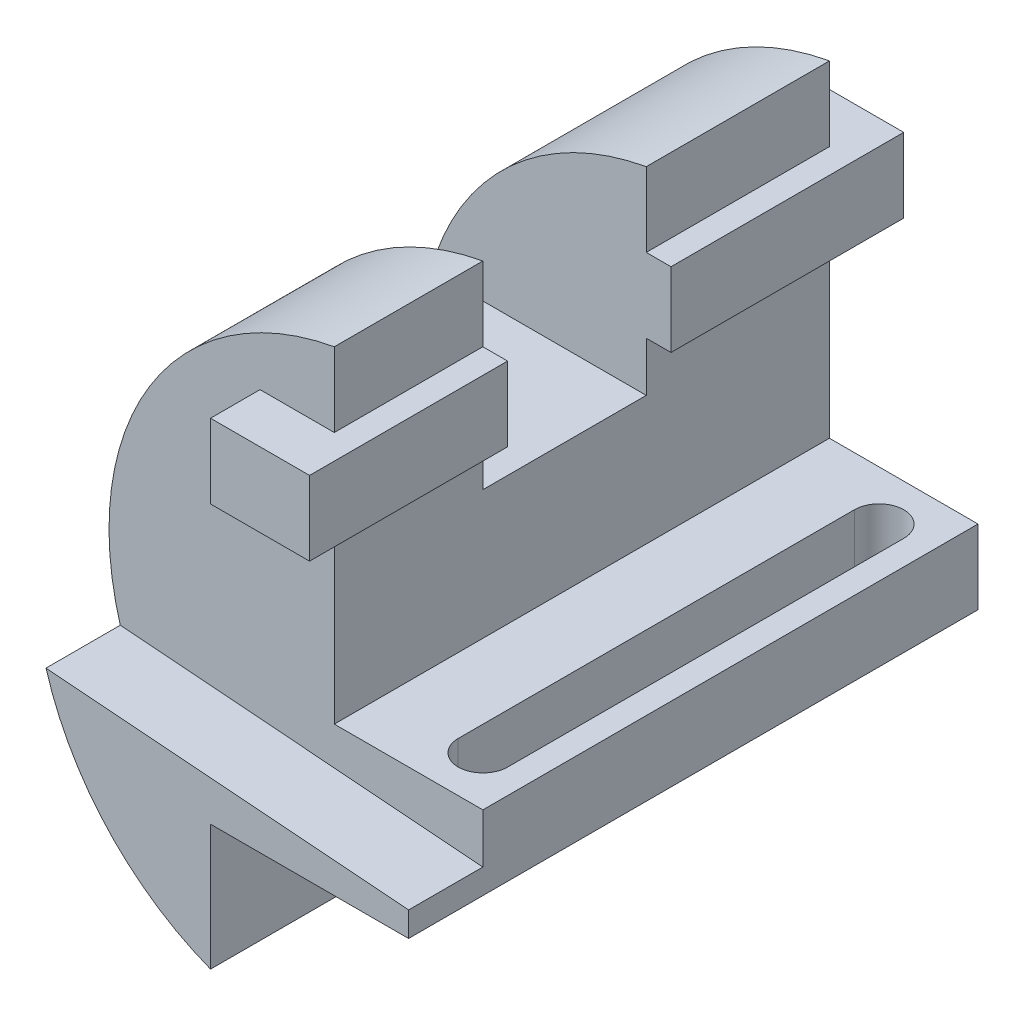
ISO-10303-21;
HEADER;
FILE_DESCRIPTION(('STEP AP214'),'2;1');
FILE_NAME('part.step','',(''),(''),'','','');
FILE_SCHEMA(('AUTOMOTIVE_DESIGN { 1 0 10303 214 1 1 1 1 }'));
ENDSEC;
DATA;
#1=APPLICATION_CONTEXT('core data for automotive mechanical design processes');
#2=APPLICATION_PROTOCOL_DEFINITION('international standard','automotive_design',2000,#1);
#3=PRODUCT_CONTEXT('',#1,'mechanical');
#4=PRODUCT('Part','Part','',(#3));
#5=PRODUCT_RELATED_PRODUCT_CATEGORY('part','',(#4));
#6=PRODUCT_DEFINITION_FORMATION('','',#4);
#7=PRODUCT_DEFINITION_CONTEXT('part definition',#1,'design');
#8=PRODUCT_DEFINITION('design','',#6,#7);
#9=PRODUCT_DEFINITION_SHAPE('','',#8);
#10=(LENGTH_UNIT() NAMED_UNIT(*) SI_UNIT(.MILLI.,.METRE.));
#11=(NAMED_UNIT(*) PLANE_ANGLE_UNIT() SI_UNIT($,.RADIAN.));
#12=(NAMED_UNIT(*) SI_UNIT($,.STERADIAN.) SOLID_ANGLE_UNIT());
#13=UNCERTAINTY_MEASURE_WITH_UNIT(LENGTH_MEASURE(1.E-05),#10,'distance_accuracy_value','');
#14=(GEOMETRIC_REPRESENTATION_CONTEXT(3) GLOBAL_UNCERTAINTY_ASSIGNED_CONTEXT((#13)) GLOBAL_UNIT_ASSIGNED_CONTEXT((#10,
#11,#12)) REPRESENTATION_CONTEXT('',''));
#15=CARTESIAN_POINT('',(0.,0.,0.));
#16=DIRECTION('',(0.,0.,1.));
#17=DIRECTION('',(1.,0.,0.));
#18=AXIS2_PLACEMENT_3D('',#15,#16,#17);
#19=CARTESIAN_POINT('',(-30.,15.,115.));
#20=DIRECTION('',(-1.,0.,0.));
#21=DIRECTION('',(0.,0.,1.));
#22=AXIS2_PLACEMENT_3D('',#19,#20,#21);
#23=PLANE('',#22);
#24=DIRECTION('',(0.,0.,1.));
#25=VECTOR('',#24,1.);
#26=CARTESIAN_POINT('',(-30.,66.,115.));
#27=LINE('',#26,#25);
#28=CARTESIAN_POINT('',(-30.,66.,70.));
#29=VERTEX_POINT('',#28);
#30=CARTESIAN_POINT('',(-30.,66.,100.));
#31=VERTEX_POINT('',#30);
#32=EDGE_CURVE('E324',#29,#31,#27,.T.);
#33=ORIENTED_EDGE('',*,*,#32,.F.);
#34=DIRECTION('',(0.,1.,0.));
#35=VECTOR('',#34,1.);
#36=CARTESIAN_POINT('',(-30.,15.,70.));
#37=LINE('',#36,#35);
#38=CARTESIAN_POINT('',(-30.0000000000001,81.,70.));
#39=VERTEX_POINT('',#38);
#40=EDGE_CURVE('E272',#29,#39,#37,.T.);
#41=ORIENTED_EDGE('',*,*,#40,.T.);
#42=DIRECTION('',(0.,0.,-1.));
#43=VECTOR('',#42,1.);
#44=CARTESIAN_POINT('',(-30.,81.,115.));
#45=LINE('',#44,#43);
#46=CARTESIAN_POINT('',(-30.,81.,100.));
#47=VERTEX_POINT('',#46);
#48=EDGE_CURVE('E396',#47,#39,#45,.T.);
#49=ORIENTED_EDGE('',*,*,#48,.F.);
#50=DIRECTION('',(0.,1.,0.));
#51=VECTOR('',#50,1.);
#52=CARTESIAN_POINT('',(-30.,15.,100.));
#53=LINE('',#52,#51);
#54=EDGE_CURVE('E346',#31,#47,#53,.T.);
#55=ORIENTED_EDGE('',*,*,#54,.F.);
#56=EDGE_LOOP('',(#33,#41,#49,#55));
#57=FACE_BOUND('',#56,.T.);
#58=ADVANCED_FACE('F45',(#57),#23,.F.);
#59=CARTESIAN_POINT('',(-25.,66.,-10.));
#60=DIRECTION('',(-1.,0.,0.));
#61=DIRECTION('',(0.,-1.,0.));
#62=AXIS2_PLACEMENT_3D('',#59,#60,#61);
#63=PLANE('',#62);
#64=DIRECTION('',(0.,0.,1.));
#65=VECTOR('',#64,1.);
#66=CARTESIAN_POINT('',(-25.,51.,-10.));
#67=LINE('',#66,#65);
#68=CARTESIAN_POINT('',(-25.,51.,70.));
#69=VERTEX_POINT('',#68);
#70=CARTESIAN_POINT('',(-25.,51.,110.));
#71=VERTEX_POINT('',#70);
#72=EDGE_CURVE('E320',#69,#71,#67,.T.);
#73=ORIENTED_EDGE('',*,*,#72,.F.);
#74=DIRECTION('',(0.,1.,0.));
#75=VECTOR('',#74,1.);
#76=CARTESIAN_POINT('',(-25.,66.,70.));
#77=LINE('',#76,#75);
#78=CARTESIAN_POINT('',(-25.,66.,70.));
#79=VERTEX_POINT('',#78);
#80=EDGE_CURVE('E269',#69,#79,#77,.T.);
#81=ORIENTED_EDGE('',*,*,#80,.T.);
#82=DIRECTION('',(0.,0.,1.));
#83=VECTOR('',#82,1.);
#84=CARTESIAN_POINT('',(-25.,66.,-10.));
#85=LINE('',#84,#83);
#86=CARTESIAN_POINT('',(-25.,66.,110.));
#87=VERTEX_POINT('',#86);
#88=EDGE_CURVE('E308',#79,#87,#85,.T.);
#89=ORIENTED_EDGE('',*,*,#88,.T.);
#90=DIRECTION('',(0.,1.,0.));
#91=VECTOR('',#90,1.);
#92=CARTESIAN_POINT('',(-25.,66.,110.));
#93=LINE('',#92,#91);
#94=EDGE_CURVE('E293',#71,#87,#93,.T.);
#95=ORIENTED_EDGE('',*,*,#94,.F.);
#96=EDGE_LOOP('',(#73,#81,#89,#95));
#97=FACE_BOUND('',#96,.T.);
#98=ADVANCED_FACE('F449',(#97),#63,.F.);
#99=CARTESIAN_POINT('',(-25.,51.,-10.));
#100=DIRECTION('',(0.,1.,0.));
#101=DIRECTION('',(0.,0.,1.));
#102=AXIS2_PLACEMENT_3D('',#99,#100,#101);
#103=PLANE('',#102);
#104=DIRECTION('',(0.,0.,-1.));
#105=VECTOR('',#104,1.);
#106=CARTESIAN_POINT('',(-30.,51.,115.));
#107=LINE('',#106,#105);
#108=CARTESIAN_POINT('',(-30.,51.,100.));
#109=VERTEX_POINT('',#108);
#110=CARTESIAN_POINT('',(-30.,51.,70.));
#111=VERTEX_POINT('',#110);
#112=EDGE_CURVE('E335',#109,#111,#107,.T.);
#113=ORIENTED_EDGE('',*,*,#112,.T.);
#114=DIRECTION('',(1.,0.,0.));
#115=VECTOR('',#114,1.);
#116=CARTESIAN_POINT('',(-25.,51.,70.));
#117=LINE('',#116,#115);
#118=EDGE_CURVE('E275',#111,#69,#117,.T.);
#119=ORIENTED_EDGE('',*,*,#118,.T.);
#120=ORIENTED_EDGE('',*,*,#72,.T.);
#121=DIRECTION('',(1.,0.,0.));
#122=VECTOR('',#121,1.);
#123=CARTESIAN_POINT('',(-25.,51.,110.));
#124=LINE('',#123,#122);
#125=CARTESIAN_POINT('',(-45.,51.,110.));
#126=VERTEX_POINT('',#125);
#127=EDGE_CURVE('E296',#126,#71,#124,.T.);
#128=ORIENTED_EDGE('',*,*,#127,.F.);
#129=DIRECTION('',(0.,0.,1.));
#130=VECTOR('',#129,1.);
#131=CARTESIAN_POINT('',(-45.,51.,-10.));
#132=LINE('',#131,#130);
#133=CARTESIAN_POINT('',(-45.,51.,100.));
#134=VERTEX_POINT('',#133);
#135=EDGE_CURVE('E316',#134,#126,#132,.T.);
#136=ORIENTED_EDGE('',*,*,#135,.F.);
#137=DIRECTION('',(-1.,0.,0.));
#138=VECTOR('',#137,1.);
#139=CARTESIAN_POINT('',(-20.,51.,100.));
#140=LINE('',#139,#138);
#141=EDGE_CURVE('E409',#109,#134,#140,.T.);
#142=ORIENTED_EDGE('',*,*,#141,.F.);
#143=EDGE_LOOP('',(#113,#119,#120,#128,#136,#142));
#144=FACE_BOUND('',#143,.T.);
#145=ADVANCED_FACE('F458',(#144),#103,.F.);
#146=CARTESIAN_POINT('',(-25.,66.,-10.));
#147=DIRECTION('',(0.,-1.,0.));
#148=DIRECTION('',(0.,0.,-1.));
#149=AXIS2_PLACEMENT_3D('',#146,#147,#148);
#150=PLANE('',#149);
#151=ORIENTED_EDGE('',*,*,#88,.F.);
#152=DIRECTION('',(-1.,0.,0.));
#153=VECTOR('',#152,1.);
#154=CARTESIAN_POINT('',(-25.,66.,70.));
#155=LINE('',#154,#153);
#156=EDGE_CURVE('E415',#79,#29,#155,.T.);
#157=ORIENTED_EDGE('',*,*,#156,.T.);
#158=ORIENTED_EDGE('',*,*,#32,.T.);
#159=DIRECTION('',(1.,0.,0.));
#160=VECTOR('',#159,1.);
#161=CARTESIAN_POINT('',(-20.,66.,100.));
#162=LINE('',#161,#160);
#163=CARTESIAN_POINT('',(-45.,66.,100.));
#164=VERTEX_POINT('',#163);
#165=EDGE_CURVE('E403',#164,#31,#162,.T.);
#166=ORIENTED_EDGE('',*,*,#165,.F.);
#167=DIRECTION('',(0.,0.,1.));
#168=VECTOR('',#167,1.);
#169=CARTESIAN_POINT('',(-45.,66.,-10.));
#170=LINE('',#169,#168);
#171=CARTESIAN_POINT('',(-45.,66.,110.));
#172=VERTEX_POINT('',#171);
#173=EDGE_CURVE('E312',#164,#172,#170,.T.);
#174=ORIENTED_EDGE('',*,*,#173,.T.);
#175=DIRECTION('',(-1.,0.,0.));
#176=VECTOR('',#175,1.);
#177=CARTESIAN_POINT('',(-25.,66.,110.));
#178=LINE('',#177,#176);
#179=EDGE_CURVE('E290',#87,#172,#178,.T.);
#180=ORIENTED_EDGE('',*,*,#179,.F.);
#181=EDGE_LOOP('',(#151,#157,#158,#166,#174,#180));
#182=FACE_BOUND('',#181,.T.);
#183=ADVANCED_FACE('F468',(#182),#150,.F.);
#184=DIRECTION('',(0.,0.,1.));
#185=VECTOR('',#184,1.);
#186=CARTESIAN_POINT('',(-30.,41.,115.));
#187=LINE('',#186,#185);
#188=CARTESIAN_POINT('',(-30.,41.,37.));
#189=VERTEX_POINT('',#188);
#190=CARTESIAN_POINT('',(-30.,41.,70.));
#191=VERTEX_POINT('',#190);
#192=EDGE_CURVE('E284',#189,#191,#187,.T.);
#193=ORIENTED_EDGE('',*,*,#192,.T.);
#194=DIRECTION('',(0.,1.,0.));
#195=VECTOR('',#194,1.);
#196=CARTESIAN_POINT('',(-30.,15.,70.));
#197=LINE('',#196,#195);
#198=EDGE_CURVE('E281',#191,#111,#197,.T.);
#199=ORIENTED_EDGE('',*,*,#198,.T.);
#200=ORIENTED_EDGE('',*,*,#112,.F.);
#201=CARTESIAN_POINT('',(-30.,15.,100.));
#202=VERTEX_POINT('',#201);
#203=EDGE_CURVE('E347',#202,#109,#53,.T.);
#204=ORIENTED_EDGE('',*,*,#203,.F.);
#205=DIRECTION('',(0.,0.,-1.));
#206=VECTOR('',#205,1.);
#207=CARTESIAN_POINT('',(-30.,15.,115.));
#208=LINE('',#207,#206);
#209=CARTESIAN_POINT('',(-30.,15.,0.));
#210=VERTEX_POINT('',#209);
#211=EDGE_CURVE('E399',#202,#210,#208,.T.);
#212=ORIENTED_EDGE('',*,*,#211,.T.);
#213=DIRECTION('',(0.,1.,0.));
#214=VECTOR('',#213,1.);
#215=CARTESIAN_POINT('',(-30.,15.,0.));
#216=LINE('',#215,#214);
#217=CARTESIAN_POINT('',(-30.,51.,0.));
#218=VERTEX_POINT('',#217);
#219=EDGE_CURVE('E379',#210,#218,#216,.T.);
#220=ORIENTED_EDGE('',*,*,#219,.T.);
#221=CARTESIAN_POINT('',(-30.,51.,37.));
#222=VERTEX_POINT('',#221);
#223=EDGE_CURVE('E334',#222,#218,#107,.T.);
#224=ORIENTED_EDGE('',*,*,#223,.F.);
#225=DIRECTION('',(0.,-1.,0.));
#226=VECTOR('',#225,1.);
#227=CARTESIAN_POINT('',(-30.,15.,37.));
#228=LINE('',#227,#226);
#229=EDGE_CURVE('E266',#222,#189,#228,.T.);
#230=ORIENTED_EDGE('',*,*,#229,.T.);
#231=EDGE_LOOP('',(#193,#199,#200,#204,#212,#220,#224,#230));
#232=FACE_BOUND('',#231,.T.);
#233=ADVANCED_FACE('F453',(#232),#23,.F.);
#234=CARTESIAN_POINT('',(-30.0000000000001,81.,37.));
#235=VERTEX_POINT('',#234);
#236=CARTESIAN_POINT('',(-30.,81.,0.));
#237=VERTEX_POINT('',#236);
#238=EDGE_CURVE('E395',#235,#237,#45,.T.);
#239=ORIENTED_EDGE('',*,*,#238,.F.);
#240=DIRECTION('',(0.,-1.,0.));
#241=VECTOR('',#240,1.);
#242=CARTESIAN_POINT('',(-30.,15.,37.));
#243=LINE('',#242,#241);
#244=CARTESIAN_POINT('',(-30.,66.,37.));
#245=VERTEX_POINT('',#244);
#246=EDGE_CURVE('E257',#235,#245,#243,.T.);
#247=ORIENTED_EDGE('',*,*,#246,.T.);
#248=CARTESIAN_POINT('',(-30.,66.,0.));
#249=VERTEX_POINT('',#248);
#250=EDGE_CURVE('E325',#249,#245,#27,.T.);
#251=ORIENTED_EDGE('',*,*,#250,.F.);
#252=EDGE_CURVE('E378',#249,#237,#216,.T.);
#253=ORIENTED_EDGE('',*,*,#252,.T.);
#254=EDGE_LOOP('',(#239,#247,#251,#253));
#255=FACE_BOUND('',#254,.T.);
#256=ADVANCED_FACE('F452',(#255),#23,.F.);
#257=CARTESIAN_POINT('',(-20.,26.4083339693685,0.));
#258=DIRECTION('',(0.,0.,-1.));
#259=DIRECTION('',(-1.,0.,0.));
#260=AXIS2_PLACEMENT_3D('',#257,#258,#259);
#261=PLANE('',#260);
#262=DIRECTION('',(0.,-1.,0.));
#263=VECTOR('',#262,1.);
#264=CARTESIAN_POINT('',(-45.,26.4083339693685,0.));
#265=LINE('',#264,#263);
#266=CARTESIAN_POINT('',(-45.,66.,0.));
#267=VERTEX_POINT('',#266);
#268=CARTESIAN_POINT('',(-45.,51.,0.));
#269=VERTEX_POINT('',#268);
#270=EDGE_CURVE('E331',#267,#269,#265,.T.);
#271=ORIENTED_EDGE('',*,*,#270,.T.);
#272=DIRECTION('',(1.,0.,0.));
#273=VECTOR('',#272,1.);
#274=CARTESIAN_POINT('',(-20.,51.,0.));
#275=LINE('',#274,#273);
#276=EDGE_CURVE('E338',#269,#218,#275,.T.);
#277=ORIENTED_EDGE('',*,*,#276,.T.);
#278=ORIENTED_EDGE('',*,*,#219,.F.);
#279=DIRECTION('',(-1.,0.,0.));
#280=VECTOR('',#279,1.);
#281=CARTESIAN_POINT('',(0.,15.,0.));
#282=LINE('',#281,#280);
#283=CARTESIAN_POINT('',(0.,15.,0.));
#284=VERTEX_POINT('',#283);
#285=EDGE_CURVE('E375',#284,#210,#282,.T.);
#286=ORIENTED_EDGE('',*,*,#285,.F.);
#287=DIRECTION('',(0.,1.,0.));
#288=VECTOR('',#287,1.);
#289=CARTESIAN_POINT('',(0.,0.,0.));
#290=LINE('',#289,#288);
#291=CARTESIAN_POINT('',(0.,0.,0.));
#292=VERTEX_POINT('',#291);
#293=EDGE_CURVE('E360',#292,#284,#290,.T.);
#294=ORIENTED_EDGE('',*,*,#293,.F.);
#295=DIRECTION('',(1.,0.,0.));
#296=VECTOR('',#295,1.);
#297=CARTESIAN_POINT('',(0.,0.,0.));
#298=LINE('',#297,#296);
#299=CARTESIAN_POINT('',(-40.,0.,0.));
#300=VERTEX_POINT('',#299);
#301=EDGE_CURVE('E366',#300,#292,#298,.T.);
#302=ORIENTED_EDGE('',*,*,#301,.F.);
#303=DIRECTION('',(0.,1.,0.));
#304=VECTOR('',#303,1.);
#305=CARTESIAN_POINT('',(-40.,0.,0.));
#306=LINE('',#305,#304);
#307=CARTESIAN_POINT('',(-40.,-25.3627969821569,0.));
#308=VERTEX_POINT('',#307);
#309=EDGE_CURVE('E384',#308,#300,#306,.T.);
#310=ORIENTED_EDGE('',*,*,#309,.F.);
#311=CARTESIAN_POINT('',(-20.,26.4083339693685,0.));
#312=DIRECTION('',(0.,0.,1.));
#313=DIRECTION('',(-1.,0.,0.));
#314=AXIS2_PLACEMENT_3D('',#311,#312,#313);
#315=CIRCLE('',#314,55.5);
#316=EDGE_CURVE('E382',#237,#308,#315,.T.);
#317=ORIENTED_EDGE('',*,*,#316,.F.);
#318=ORIENTED_EDGE('',*,*,#252,.F.);
#319=DIRECTION('',(-1.,0.,0.));
#320=VECTOR('',#319,1.);
#321=CARTESIAN_POINT('',(-20.,66.,0.));
#322=LINE('',#321,#320);
#323=EDGE_CURVE('E328',#249,#267,#322,.T.);
#324=ORIENTED_EDGE('',*,*,#323,.T.);
#325=EDGE_LOOP('',(#271,#277,#278,#286,#294,#302,#310,#317,#318,#324));
#326=FACE_BOUND('',#325,.T.);
#327=ADVANCED_FACE('F465',(#326),#261,.T.);
#328=CARTESIAN_POINT('',(-20.,26.4083339693685,100.));
#329=DIRECTION('',(0.,0.,1.));
#330=DIRECTION('',(1.,0.,0.));
#331=AXIS2_PLACEMENT_3D('',#328,#329,#330);
#332=PLANE('',#331);
#333=ORIENTED_EDGE('',*,*,#203,.T.);
#334=ORIENTED_EDGE('',*,*,#141,.T.);
#335=DIRECTION('',(0.,1.,0.));
#336=VECTOR('',#335,1.);
#337=CARTESIAN_POINT('',(-45.,26.4083339693685,100.));
#338=LINE('',#337,#336);
#339=EDGE_CURVE('E406',#134,#164,#338,.T.);
#340=ORIENTED_EDGE('',*,*,#339,.T.);
#341=ORIENTED_EDGE('',*,*,#165,.T.);
#342=ORIENTED_EDGE('',*,*,#54,.T.);
#343=CARTESIAN_POINT('',(-20.,26.4083339693685,100.));
#344=DIRECTION('',(0.,0.,1.));
#345=DIRECTION('',(1.,0.,0.));
#346=AXIS2_PLACEMENT_3D('',#343,#344,#345);
#347=CIRCLE('',#346,55.5);
#348=CARTESIAN_POINT('',(-73.2263825921053,10.6856689230469,100.));
#349=VERTEX_POINT('',#348);
#350=EDGE_CURVE('E350',#47,#349,#347,.T.);
#351=ORIENTED_EDGE('',*,*,#350,.T.);
#352=DIRECTION('',(0.996999181764582,-0.0774120892416338,0.));
#353=VECTOR('',#352,1.);
#354=CARTESIAN_POINT('',(0.,5.,100.));
#355=LINE('',#354,#353);
#356=CARTESIAN_POINT('',(0.,5.,100.));
#357=VERTEX_POINT('',#356);
#358=EDGE_CURVE('E352',#349,#357,#355,.T.);
#359=ORIENTED_EDGE('',*,*,#358,.T.);
#360=DIRECTION('',(0.,1.,0.));
#361=VECTOR('',#360,1.);
#362=CARTESIAN_POINT('',(0.,5.,100.));
#363=LINE('',#362,#361);
#364=CARTESIAN_POINT('',(0.,15.,100.));
#365=VERTEX_POINT('',#364);
#366=EDGE_CURVE('E342',#357,#365,#363,.T.);
#367=ORIENTED_EDGE('',*,*,#366,.T.);
#368=DIRECTION('',(-1.,0.,0.));
#369=VECTOR('',#368,1.);
#370=CARTESIAN_POINT('',(0.,15.,100.));
#371=LINE('',#370,#369);
#372=EDGE_CURVE('E344',#365,#202,#371,.T.);
#373=ORIENTED_EDGE('',*,*,#372,.T.);
#374=EDGE_LOOP('',(#333,#334,#340,#341,#342,#351,#359,#367,#373));
#375=FACE_BOUND('',#374,.T.);
#376=ADVANCED_FACE('F511',(#375),#332,.T.);
#377=CARTESIAN_POINT('',(0.,15.,115.));
#378=DIRECTION('',(0.,-1.,0.));
#379=DIRECTION('',(1.,0.,0.));
#380=AXIS2_PLACEMENT_3D('',#377,#378,#379);
#381=PLANE('',#380);
#382=DIRECTION('',(0.,0.,-1.));
#383=VECTOR('',#382,1.);
#384=CARTESIAN_POINT('',(-14.9803454801797,15.,115.));
#385=LINE('',#384,#383);
#386=CARTESIAN_POINT('',(-14.9803454801797,15.,90.));
#387=VERTEX_POINT('',#386);
#388=CARTESIAN_POINT('',(-14.9803454801797,15.,10.));
#389=VERTEX_POINT('',#388);
#390=EDGE_CURVE('E221',#387,#389,#385,.T.);
#391=ORIENTED_EDGE('',*,*,#390,.T.);
#392=CARTESIAN_POINT('',(-9.98034548017967,15.,10.));
#393=DIRECTION('',(0.,-1.,0.));
#394=DIRECTION('',(1.,0.,0.));
#395=AXIS2_PLACEMENT_3D('',#392,#393,#394);
#396=CIRCLE('',#395,5.);
#397=CARTESIAN_POINT('',(-4.98034548017966,15.,10.));
#398=VERTEX_POINT('',#397);
#399=EDGE_CURVE('E243',#389,#398,#396,.T.);
#400=ORIENTED_EDGE('',*,*,#399,.T.);
#401=DIRECTION('',(0.,0.,1.));
#402=VECTOR('',#401,1.);
#403=CARTESIAN_POINT('',(-4.98034548017967,15.,115.));
#404=LINE('',#403,#402);
#405=CARTESIAN_POINT('',(-4.98034548017967,15.,90.));
#406=VERTEX_POINT('',#405);
#407=EDGE_CURVE('E241',#398,#406,#404,.T.);
#408=ORIENTED_EDGE('',*,*,#407,.T.);
#409=CARTESIAN_POINT('',(-9.98034548017967,15.,90.));
#410=DIRECTION('',(0.,-1.,0.));
#411=DIRECTION('',(1.,0.,0.));
#412=AXIS2_PLACEMENT_3D('',#409,#410,#411);
#413=CIRCLE('',#412,5.);
#414=EDGE_CURVE('E226',#406,#387,#413,.T.);
#415=ORIENTED_EDGE('',*,*,#414,.T.);
#416=EDGE_LOOP('',(#391,#400,#408,#415));
#417=FACE_BOUND('',#416,.T.);
#418=ORIENTED_EDGE('',*,*,#372,.F.);
#419=DIRECTION('',(0.,0.,-1.));
#420=VECTOR('',#419,1.);
#421=CARTESIAN_POINT('',(0.,15.,115.));
#422=LINE('',#421,#420);
#423=EDGE_CURVE('E401',#365,#284,#422,.T.);
#424=ORIENTED_EDGE('',*,*,#423,.T.);
#425=ORIENTED_EDGE('',*,*,#285,.T.);
#426=ORIENTED_EDGE('',*,*,#211,.F.);
#427=EDGE_LOOP('',(#418,#424,#425,#426));
#428=FACE_BOUND('',#427,.T.);
#429=ADVANCED_FACE('F239',(#417,#428),#381,.F.);
#430=CARTESIAN_POINT('',(0.,0.,115.));
#431=DIRECTION('',(-1.,0.,0.));
#432=DIRECTION('',(0.,0.,1.));
#433=AXIS2_PLACEMENT_3D('',#430,#431,#432);
#434=PLANE('',#433);
#435=ORIENTED_EDGE('',*,*,#366,.F.);
#436=DIRECTION('',(0.,0.,1.));
#437=VECTOR('',#436,1.);
#438=CARTESIAN_POINT('',(0.,5.,100.));
#439=LINE('',#438,#437);
#440=CARTESIAN_POINT('',(0.,5.,115.));
#441=VERTEX_POINT('',#440);
#442=EDGE_CURVE('E357',#357,#441,#439,.T.);
#443=ORIENTED_EDGE('',*,*,#442,.T.);
#444=DIRECTION('',(0.,1.,0.));
#445=VECTOR('',#444,1.);
#446=CARTESIAN_POINT('',(0.,0.,115.));
#447=LINE('',#446,#445);
#448=CARTESIAN_POINT('',(0.,0.,115.));
#449=VERTEX_POINT('',#448);
#450=EDGE_CURVE('E362',#449,#441,#447,.T.);
#451=ORIENTED_EDGE('',*,*,#450,.F.);
#452=DIRECTION('',(0.,0.,-1.));
#453=VECTOR('',#452,1.);
#454=CARTESIAN_POINT('',(0.,0.,115.));
#455=LINE('',#454,#453);
#456=EDGE_CURVE('E372',#449,#292,#455,.T.);
#457=ORIENTED_EDGE('',*,*,#456,.T.);
#458=ORIENTED_EDGE('',*,*,#293,.T.);
#459=ORIENTED_EDGE('',*,*,#423,.F.);
#460=EDGE_LOOP('',(#435,#443,#451,#457,#458,#459));
#461=FACE_BOUND('',#460,.T.);
#462=ADVANCED_FACE('F47',(#461),#434,.F.);
#463=CARTESIAN_POINT('',(-20.,26.4083339693685,115.));
#464=DIRECTION('',(0.,0.,-1.));
#465=DIRECTION('',(-1.,0.,0.));
#466=AXIS2_PLACEMENT_3D('',#463,#464,#465);
#467=CYLINDRICAL_SURFACE('',#466,55.5);
#468=ORIENTED_EDGE('',*,*,#48,.T.);
#469=CARTESIAN_POINT('',(-20.,26.4083339693685,70.));
#470=DIRECTION('',(0.,0.,1.));
#471=DIRECTION('',(1.,0.,0.));
#472=AXIS2_PLACEMENT_3D('',#469,#470,#471);
#473=CIRCLE('',#472,55.5);
#474=CARTESIAN_POINT('',(-73.5474862383895,41.,70.));
#475=VERTEX_POINT('',#474);
#476=EDGE_CURVE('E278',#39,#475,#473,.T.);
#477=ORIENTED_EDGE('',*,*,#476,.T.);
#478=DIRECTION('',(0.,0.,-1.));
#479=VECTOR('',#478,1.);
#480=CARTESIAN_POINT('',(-73.5474862383895,41.,115.));
#481=LINE('',#480,#479);
#482=CARTESIAN_POINT('',(-73.5474862383895,41.,37.));
#483=VERTEX_POINT('',#482);
#484=EDGE_CURVE('E418',#475,#483,#481,.T.);
#485=ORIENTED_EDGE('',*,*,#484,.T.);
#486=CARTESIAN_POINT('',(-20.,26.4083339693685,37.));
#487=DIRECTION('',(0.,0.,-1.));
#488=DIRECTION('',(0.,1.,0.));
#489=AXIS2_PLACEMENT_3D('',#486,#487,#488);
#490=CIRCLE('',#489,55.5);
#491=EDGE_CURVE('E263',#483,#235,#490,.T.);
#492=ORIENTED_EDGE('',*,*,#491,.T.);
#493=ORIENTED_EDGE('',*,*,#238,.T.);
#494=ORIENTED_EDGE('',*,*,#316,.T.);
#495=DIRECTION('',(0.,0.,-1.));
#496=VECTOR('',#495,1.);
#497=CARTESIAN_POINT('',(-40.,-25.3627969821569,115.));
#498=LINE('',#497,#496);
#499=CARTESIAN_POINT('',(-40.,-25.3627969821569,115.));
#500=VERTEX_POINT('',#499);
#501=EDGE_CURVE('E392',#500,#308,#498,.T.);
#502=ORIENTED_EDGE('',*,*,#501,.F.);
#503=CARTESIAN_POINT('',(-20.,26.4083339693685,115.));
#504=DIRECTION('',(0.,0.,1.));
#505=DIRECTION('',(-1.,0.,0.));
#506=AXIS2_PLACEMENT_3D('',#503,#504,#505);
#507=CIRCLE('',#506,55.5);
#508=CARTESIAN_POINT('',(-73.2263825921054,10.6856689230469,115.));
#509=VERTEX_POINT('',#508);
#510=EDGE_CURVE('E365',#509,#500,#507,.T.);
#511=ORIENTED_EDGE('',*,*,#510,.F.);
#512=DIRECTION('',(0.,0.,1.));
#513=VECTOR('',#512,1.);
#514=CARTESIAN_POINT('',(-73.2263825921053,10.6856689230469,100.));
#515=LINE('',#514,#513);
#516=EDGE_CURVE('E355',#349,#509,#515,.T.);
#517=ORIENTED_EDGE('',*,*,#516,.F.);
#518=ORIENTED_EDGE('',*,*,#350,.F.);
#519=EDGE_LOOP('',(#468,#477,#485,#492,#493,#494,#502,#511,#517,#518));
#520=FACE_BOUND('',#519,.T.);
#521=ADVANCED_FACE('F484',(#520),#467,.T.);
#522=CARTESIAN_POINT('',(-40.,0.,115.));
#523=DIRECTION('',(-1.,0.,0.));
#524=DIRECTION('',(0.,-1.,0.));
#525=AXIS2_PLACEMENT_3D('',#522,#523,#524);
#526=PLANE('',#525);
#527=ORIENTED_EDGE('',*,*,#309,.T.);
#528=DIRECTION('',(0.,0.,-1.));
#529=VECTOR('',#528,1.);
#530=CARTESIAN_POINT('',(-40.,0.,115.));
#531=LINE('',#530,#529);
#532=CARTESIAN_POINT('',(-40.,0.,115.));
#533=VERTEX_POINT('',#532);
#534=EDGE_CURVE('E389',#533,#300,#531,.T.);
#535=ORIENTED_EDGE('',*,*,#534,.F.);
#536=DIRECTION('',(0.,1.,0.));
#537=VECTOR('',#536,1.);
#538=CARTESIAN_POINT('',(-40.,0.,115.));
#539=LINE('',#538,#537);
#540=EDGE_CURVE('E368',#500,#533,#539,.T.);
#541=ORIENTED_EDGE('',*,*,#540,.F.);
#542=ORIENTED_EDGE('',*,*,#501,.T.);
#543=EDGE_LOOP('',(#527,#535,#541,#542));
#544=FACE_BOUND('',#543,.T.);
#545=ADVANCED_FACE('F496',(#544),#526,.F.);
#546=CARTESIAN_POINT('',(0.,0.,115.));
#547=DIRECTION('',(0.,1.,0.));
#548=DIRECTION('',(-1.,0.,0.));
#549=AXIS2_PLACEMENT_3D('',#546,#547,#548);
#550=PLANE('',#549);
#551=DIRECTION('',(0.,0.,-1.));
#552=VECTOR('',#551,1.);
#553=CARTESIAN_POINT('',(-4.98034548017967,0.,115.));
#554=LINE('',#553,#552);
#555=CARTESIAN_POINT('',(-4.98034548017967,0.,90.));
#556=VERTEX_POINT('',#555);
#557=CARTESIAN_POINT('',(-4.98034548017966,0.,10.));
#558=VERTEX_POINT('',#557);
#559=EDGE_CURVE('E53',#556,#558,#554,.T.);
#560=ORIENTED_EDGE('',*,*,#559,.T.);
#561=CARTESIAN_POINT('',(-9.98034548017966,0.,10.));
#562=DIRECTION('',(0.,1.,0.));
#563=DIRECTION('',(-1.,0.,0.));
#564=AXIS2_PLACEMENT_3D('',#561,#562,#563);
#565=CIRCLE('',#564,5.);
#566=CARTESIAN_POINT('',(-14.9803454801797,0.,10.));
#567=VERTEX_POINT('',#566);
#568=EDGE_CURVE('E12',#558,#567,#565,.T.);
#569=ORIENTED_EDGE('',*,*,#568,.T.);
#570=DIRECTION('',(0.,0.,1.));
#571=VECTOR('',#570,1.);
#572=CARTESIAN_POINT('',(-14.9803454801797,0.,115.));
#573=LINE('',#572,#571);
#574=CARTESIAN_POINT('',(-14.9803454801797,0.,90.));
#575=VERTEX_POINT('',#574);
#576=EDGE_CURVE('E421',#567,#575,#573,.T.);
#577=ORIENTED_EDGE('',*,*,#576,.T.);
#578=CARTESIAN_POINT('',(-9.98034548017967,0.,90.));
#579=DIRECTION('',(0.,1.,0.));
#580=DIRECTION('',(-1.,0.,0.));
#581=AXIS2_PLACEMENT_3D('',#578,#579,#580);
#582=CIRCLE('',#581,5.);
#583=EDGE_CURVE('E234',#575,#556,#582,.T.);
#584=ORIENTED_EDGE('',*,*,#583,.T.);
#585=EDGE_LOOP('',(#560,#569,#577,#584));
#586=FACE_BOUND('',#585,.T.);
#587=ORIENTED_EDGE('',*,*,#301,.T.);
#588=ORIENTED_EDGE('',*,*,#456,.F.);
#589=DIRECTION('',(1.,0.,0.));
#590=VECTOR('',#589,1.);
#591=CARTESIAN_POINT('',(0.,0.,115.));
#592=LINE('',#591,#590);
#593=EDGE_CURVE('E370',#533,#449,#592,.T.);
#594=ORIENTED_EDGE('',*,*,#593,.F.);
#595=ORIENTED_EDGE('',*,*,#534,.T.);
#596=EDGE_LOOP('',(#587,#588,#594,#595));
#597=FACE_BOUND('',#596,.T.);
#598=ADVANCED_FACE('F425',(#586,#597),#550,.F.);
#599=CARTESIAN_POINT('',(-20.,26.4083339693685,115.));
#600=DIRECTION('',(0.,0.,-1.));
#601=DIRECTION('',(-1.,0.,0.));
#602=AXIS2_PLACEMENT_3D('',#599,#600,#601);
#603=PLANE('',#602);
#604=ORIENTED_EDGE('',*,*,#450,.T.);
#605=DIRECTION('',(0.996999181764582,-0.0774120892416338,0.));
#606=VECTOR('',#605,1.);
#607=CARTESIAN_POINT('',(0.,5.,115.));
#608=LINE('',#607,#606);
#609=EDGE_CURVE('E341',#509,#441,#608,.T.);
#610=ORIENTED_EDGE('',*,*,#609,.F.);
#611=ORIENTED_EDGE('',*,*,#510,.T.);
#612=ORIENTED_EDGE('',*,*,#540,.T.);
#613=ORIENTED_EDGE('',*,*,#593,.T.);
#614=EDGE_LOOP('',(#604,#610,#611,#612,#613));
#615=FACE_BOUND('',#614,.T.);
#616=ADVANCED_FACE('F500',(#615),#603,.F.);
#617=CARTESIAN_POINT('',(0.,5.,100.));
#618=DIRECTION('',(-0.0774120892416338,-0.996999181764582,0.));
#619=DIRECTION('',(0.996999181764582,-0.0774120892416338,0.));
#620=AXIS2_PLACEMENT_3D('',#617,#618,#619);
#621=PLANE('',#620);
#622=ORIENTED_EDGE('',*,*,#609,.T.);
#623=ORIENTED_EDGE('',*,*,#442,.F.);
#624=ORIENTED_EDGE('',*,*,#358,.F.);
#625=ORIENTED_EDGE('',*,*,#516,.T.);
#626=EDGE_LOOP('',(#622,#623,#624,#625));
#627=FACE_BOUND('',#626,.T.);
#628=ADVANCED_FACE('F508',(#627),#621,.F.);
#629=CARTESIAN_POINT('',(-45.,66.,-10.));
#630=DIRECTION('',(1.,0.,0.));
#631=DIRECTION('',(0.,0.,-1.));
#632=AXIS2_PLACEMENT_3D('',#629,#630,#631);
#633=PLANE('',#632);
#634=ORIENTED_EDGE('',*,*,#270,.F.);
#635=CARTESIAN_POINT('',(-45.,66.,-10.));
#636=VERTEX_POINT('',#635);
#637=EDGE_CURVE('E313',#636,#267,#170,.T.);
#638=ORIENTED_EDGE('',*,*,#637,.F.);
#639=DIRECTION('',(0.,1.,0.));
#640=VECTOR('',#639,1.);
#641=CARTESIAN_POINT('',(-45.,66.,-10.));
#642=LINE('',#641,#640);
#643=CARTESIAN_POINT('',(-45.,51.,-10.));
#644=VERTEX_POINT('',#643);
#645=EDGE_CURVE('E304',#644,#636,#642,.T.);
#646=ORIENTED_EDGE('',*,*,#645,.F.);
#647=EDGE_CURVE('E317',#644,#269,#132,.T.);
#648=ORIENTED_EDGE('',*,*,#647,.T.);
#649=EDGE_LOOP('',(#634,#638,#646,#648));
#650=FACE_BOUND('',#649,.T.);
#651=ADVANCED_FACE('F553',(#650),#633,.F.);
#652=CARTESIAN_POINT('',(-25.,66.,-10.));
#653=VERTEX_POINT('',#652);
#654=CARTESIAN_POINT('',(-25.,66.,37.));
#655=VERTEX_POINT('',#654);
#656=EDGE_CURVE('E309',#653,#655,#85,.T.);
#657=ORIENTED_EDGE('',*,*,#656,.T.);
#658=DIRECTION('',(0.,-1.,0.));
#659=VECTOR('',#658,1.);
#660=CARTESIAN_POINT('',(-25.,66.,37.));
#661=LINE('',#660,#659);
#662=CARTESIAN_POINT('',(-25.,51.,37.));
#663=VERTEX_POINT('',#662);
#664=EDGE_CURVE('E252',#655,#663,#661,.T.);
#665=ORIENTED_EDGE('',*,*,#664,.T.);
#666=CARTESIAN_POINT('',(-25.,51.,-10.));
#667=VERTEX_POINT('',#666);
#668=EDGE_CURVE('E321',#667,#663,#67,.T.);
#669=ORIENTED_EDGE('',*,*,#668,.F.);
#670=DIRECTION('',(0.,-1.,0.));
#671=VECTOR('',#670,1.);
#672=CARTESIAN_POINT('',(-25.,66.,-10.));
#673=LINE('',#672,#671);
#674=EDGE_CURVE('E299',#653,#667,#673,.T.);
#675=ORIENTED_EDGE('',*,*,#674,.F.);
#676=EDGE_LOOP('',(#657,#665,#669,#675));
#677=FACE_BOUND('',#676,.T.);
#678=ADVANCED_FACE('F461',(#677),#63,.F.);
#679=ORIENTED_EDGE('',*,*,#668,.T.);
#680=DIRECTION('',(-1.,0.,0.));
#681=VECTOR('',#680,1.);
#682=CARTESIAN_POINT('',(-25.,51.,37.));
#683=LINE('',#682,#681);
#684=EDGE_CURVE('E260',#663,#222,#683,.T.);
#685=ORIENTED_EDGE('',*,*,#684,.T.);
#686=ORIENTED_EDGE('',*,*,#223,.T.);
#687=ORIENTED_EDGE('',*,*,#276,.F.);
#688=ORIENTED_EDGE('',*,*,#647,.F.);
#689=DIRECTION('',(-1.,0.,0.));
#690=VECTOR('',#689,1.);
#691=CARTESIAN_POINT('',(-25.,51.,-10.));
#692=LINE('',#691,#690);
#693=EDGE_CURVE('E302',#667,#644,#692,.T.);
#694=ORIENTED_EDGE('',*,*,#693,.F.);
#695=EDGE_LOOP('',(#679,#685,#686,#687,#688,#694));
#696=FACE_BOUND('',#695,.T.);
#697=ADVANCED_FACE('F552',(#696),#103,.F.);
#698=ORIENTED_EDGE('',*,*,#339,.F.);
#699=ORIENTED_EDGE('',*,*,#135,.T.);
#700=DIRECTION('',(0.,-1.,0.));
#701=VECTOR('',#700,1.);
#702=CARTESIAN_POINT('',(-45.,66.,110.));
#703=LINE('',#702,#701);
#704=EDGE_CURVE('E287',#172,#126,#703,.T.);
#705=ORIENTED_EDGE('',*,*,#704,.F.);
#706=ORIENTED_EDGE('',*,*,#173,.F.);
#707=EDGE_LOOP('',(#698,#699,#705,#706));
#708=FACE_BOUND('',#707,.T.);
#709=ADVANCED_FACE('F526',(#708),#633,.F.);
#710=ORIENTED_EDGE('',*,*,#250,.T.);
#711=DIRECTION('',(1.,0.,0.));
#712=VECTOR('',#711,1.);
#713=CARTESIAN_POINT('',(-25.,66.,37.));
#714=LINE('',#713,#712);
#715=EDGE_CURVE('E412',#245,#655,#714,.T.);
#716=ORIENTED_EDGE('',*,*,#715,.T.);
#717=ORIENTED_EDGE('',*,*,#656,.F.);
#718=DIRECTION('',(1.,0.,0.));
#719=VECTOR('',#718,1.);
#720=CARTESIAN_POINT('',(-25.,66.,-10.));
#721=LINE('',#720,#719);
#722=EDGE_CURVE('E306',#636,#653,#721,.T.);
#723=ORIENTED_EDGE('',*,*,#722,.F.);
#724=ORIENTED_EDGE('',*,*,#637,.T.);
#725=ORIENTED_EDGE('',*,*,#323,.F.);
#726=EDGE_LOOP('',(#710,#716,#717,#723,#724,#725));
#727=FACE_BOUND('',#726,.T.);
#728=ADVANCED_FACE('F475',(#727),#150,.F.);
#729=CARTESIAN_POINT('',(0.,0.,-10.));
#730=DIRECTION('',(0.,0.,-1.));
#731=DIRECTION('',(-1.,0.,0.));
#732=AXIS2_PLACEMENT_3D('',#729,#730,#731);
#733=PLANE('',#732);
#734=ORIENTED_EDGE('',*,*,#674,.T.);
#735=ORIENTED_EDGE('',*,*,#693,.T.);
#736=ORIENTED_EDGE('',*,*,#645,.T.);
#737=ORIENTED_EDGE('',*,*,#722,.T.);
#738=EDGE_LOOP('',(#734,#735,#736,#737));
#739=FACE_BOUND('',#738,.T.);
#740=ADVANCED_FACE('F544',(#739),#733,.T.);
#741=CARTESIAN_POINT('',(-20.,26.4083339693685,110.));
#742=DIRECTION('',(0.,0.,-1.));
#743=DIRECTION('',(-1.,0.,0.));
#744=AXIS2_PLACEMENT_3D('',#741,#742,#743);
#745=PLANE('',#744);
#746=ORIENTED_EDGE('',*,*,#94,.T.);
#747=ORIENTED_EDGE('',*,*,#179,.T.);
#748=ORIENTED_EDGE('',*,*,#704,.T.);
#749=ORIENTED_EDGE('',*,*,#127,.T.);
#750=EDGE_LOOP('',(#746,#747,#748,#749));
#751=FACE_BOUND('',#750,.T.);
#752=ADVANCED_FACE('F529',(#751),#745,.F.);
#753=CARTESIAN_POINT('',(-75.5,41.,70.));
#754=DIRECTION('',(0.,-1.,0.));
#755=DIRECTION('',(0.,0.,-1.));
#756=AXIS2_PLACEMENT_3D('',#753,#754,#755);
#757=PLANE('',#756);
#758=DIRECTION('',(1.,0.,0.));
#759=VECTOR('',#758,1.);
#760=CARTESIAN_POINT('',(-75.5,41.,37.));
#761=LINE('',#760,#759);
#762=EDGE_CURVE('E249',#483,#189,#761,.T.);
#763=ORIENTED_EDGE('',*,*,#762,.F.);
#764=ORIENTED_EDGE('',*,*,#484,.F.);
#765=DIRECTION('',(1.,0.,0.));
#766=VECTOR('',#765,1.);
#767=CARTESIAN_POINT('',(-75.5,41.,70.));
#768=LINE('',#767,#766);
#769=EDGE_CURVE('E248',#475,#191,#768,.T.);
#770=ORIENTED_EDGE('',*,*,#769,.T.);
#771=ORIENTED_EDGE('',*,*,#192,.F.);
#772=EDGE_LOOP('',(#763,#764,#770,#771));
#773=FACE_BOUND('',#772,.T.);
#774=ADVANCED_FACE('F480',(#773),#757,.F.);
#775=CARTESIAN_POINT('',(-75.5,81.,70.));
#776=DIRECTION('',(0.,0.,1.));
#777=DIRECTION('',(1.,0.,0.));
#778=AXIS2_PLACEMENT_3D('',#775,#776,#777);
#779=PLANE('',#778);
#780=ORIENTED_EDGE('',*,*,#769,.F.);
#781=ORIENTED_EDGE('',*,*,#476,.F.);
#782=ORIENTED_EDGE('',*,*,#40,.F.);
#783=ORIENTED_EDGE('',*,*,#156,.F.);
#784=ORIENTED_EDGE('',*,*,#80,.F.);
#785=ORIENTED_EDGE('',*,*,#118,.F.);
#786=ORIENTED_EDGE('',*,*,#198,.F.);
#787=EDGE_LOOP('',(#780,#781,#782,#783,#784,#785,#786));
#788=FACE_BOUND('',#787,.T.);
#789=ADVANCED_FACE('F444',(#788),#779,.F.);
#790=CARTESIAN_POINT('',(-75.5,81.,37.));
#791=DIRECTION('',(0.,0.,-1.));
#792=DIRECTION('',(0.,1.,0.));
#793=AXIS2_PLACEMENT_3D('',#790,#791,#792);
#794=PLANE('',#793);
#795=ORIENTED_EDGE('',*,*,#684,.F.);
#796=ORIENTED_EDGE('',*,*,#664,.F.);
#797=ORIENTED_EDGE('',*,*,#715,.F.);
#798=ORIENTED_EDGE('',*,*,#246,.F.);
#799=ORIENTED_EDGE('',*,*,#491,.F.);
#800=ORIENTED_EDGE('',*,*,#762,.T.);
#801=ORIENTED_EDGE('',*,*,#229,.F.);
#802=EDGE_LOOP('',(#795,#796,#797,#798,#799,#800,#801));
#803=FACE_BOUND('',#802,.T.);
#804=ADVANCED_FACE('F436',(#803),#794,.F.);
#805=CARTESIAN_POINT('',(-9.98034548017966,-25.3627969821569,10.));
#806=DIRECTION('',(0.,1.,0.));
#807=DIRECTION('',(-1.,0.,0.));
#808=AXIS2_PLACEMENT_3D('',#805,#806,#807);
#809=CYLINDRICAL_SURFACE('',#808,5.);
#810=DIRECTION('',(0.,1.,0.));
#811=VECTOR('',#810,1.);
#812=CARTESIAN_POINT('',(-14.9803454801797,-25.3627969821569,10.));
#813=LINE('',#812,#811);
#814=EDGE_CURVE('E60',#567,#389,#813,.T.);
#815=ORIENTED_EDGE('',*,*,#814,.F.);
#816=ORIENTED_EDGE('',*,*,#568,.F.);
#817=DIRECTION('',(0.,1.,0.));
#818=VECTOR('',#817,1.);
#819=CARTESIAN_POINT('',(-4.98034548017966,-25.3627969821569,10.));
#820=LINE('',#819,#818);
#821=EDGE_CURVE('E227',#558,#398,#820,.T.);
#822=ORIENTED_EDGE('',*,*,#821,.T.);
#823=ORIENTED_EDGE('',*,*,#399,.F.);
#824=EDGE_LOOP('',(#815,#816,#822,#823));
#825=FACE_BOUND('',#824,.T.);
#826=ADVANCED_FACE('F434',(#825),#809,.F.);
#827=CARTESIAN_POINT('',(-4.98034548017966,-25.3627969821569,10.));
#828=DIRECTION('',(1.,0.,0.));
#829=DIRECTION('',(0.,1.,0.));
#830=AXIS2_PLACEMENT_3D('',#827,#828,#829);
#831=PLANE('',#830);
#832=ORIENTED_EDGE('',*,*,#821,.F.);
#833=ORIENTED_EDGE('',*,*,#559,.F.);
#834=DIRECTION('',(0.,1.,0.));
#835=VECTOR('',#834,1.);
#836=CARTESIAN_POINT('',(-4.98034548017967,-25.3627969821569,90.));
#837=LINE('',#836,#835);
#838=EDGE_CURVE('E236',#556,#406,#837,.T.);
#839=ORIENTED_EDGE('',*,*,#838,.T.);
#840=ORIENTED_EDGE('',*,*,#407,.F.);
#841=EDGE_LOOP('',(#832,#833,#839,#840));
#842=FACE_BOUND('',#841,.T.);
#843=ADVANCED_FACE('F429',(#842),#831,.F.);
#844=CARTESIAN_POINT('',(-9.98034548017967,-25.3627969821569,90.));
#845=DIRECTION('',(0.,1.,0.));
#846=DIRECTION('',(-1.,0.,0.));
#847=AXIS2_PLACEMENT_3D('',#844,#845,#846);
#848=CYLINDRICAL_SURFACE('',#847,5.);
#849=ORIENTED_EDGE('',*,*,#838,.F.);
#850=ORIENTED_EDGE('',*,*,#583,.F.);
#851=DIRECTION('',(0.,1.,0.));
#852=VECTOR('',#851,1.);
#853=CARTESIAN_POINT('',(-14.9803454801797,-25.3627969821569,90.));
#854=LINE('',#853,#852);
#855=EDGE_CURVE('E65',#575,#387,#854,.T.);
#856=ORIENTED_EDGE('',*,*,#855,.T.);
#857=ORIENTED_EDGE('',*,*,#414,.F.);
#858=EDGE_LOOP('',(#849,#850,#856,#857));
#859=FACE_BOUND('',#858,.T.);
#860=ADVANCED_FACE('F231',(#859),#848,.F.);
#861=CARTESIAN_POINT('',(-14.9803454801797,-25.3627969821569,10.));
#862=DIRECTION('',(-1.,0.,0.));
#863=DIRECTION('',(0.,-1.,0.));
#864=AXIS2_PLACEMENT_3D('',#861,#862,#863);
#865=PLANE('',#864);
#866=ORIENTED_EDGE('',*,*,#855,.F.);
#867=ORIENTED_EDGE('',*,*,#576,.F.);
#868=ORIENTED_EDGE('',*,*,#814,.T.);
#869=ORIENTED_EDGE('',*,*,#390,.F.);
#870=EDGE_LOOP('',(#866,#867,#868,#869));
#871=FACE_BOUND('',#870,.T.);
#872=ADVANCED_FACE('F222',(#871),#865,.F.);
#873=CLOSED_SHELL('',(#58,#98,#145,#183,#233,#256,#327,#376,#429,#462,#521,#545,#598,#616,#628,
#651,#678,#697,#709,#728,#740,#752,#774,#789,#804,#826,#843,#860,#872));
#874=MANIFOLD_SOLID_BREP('B2',#873);
#875=ADVANCED_BREP_SHAPE_REPRESENTATION('',(#18,#874),#14);
#876=SHAPE_DEFINITION_REPRESENTATION(#9,#875);
ENDSEC;
END-ISO-10303-21;
